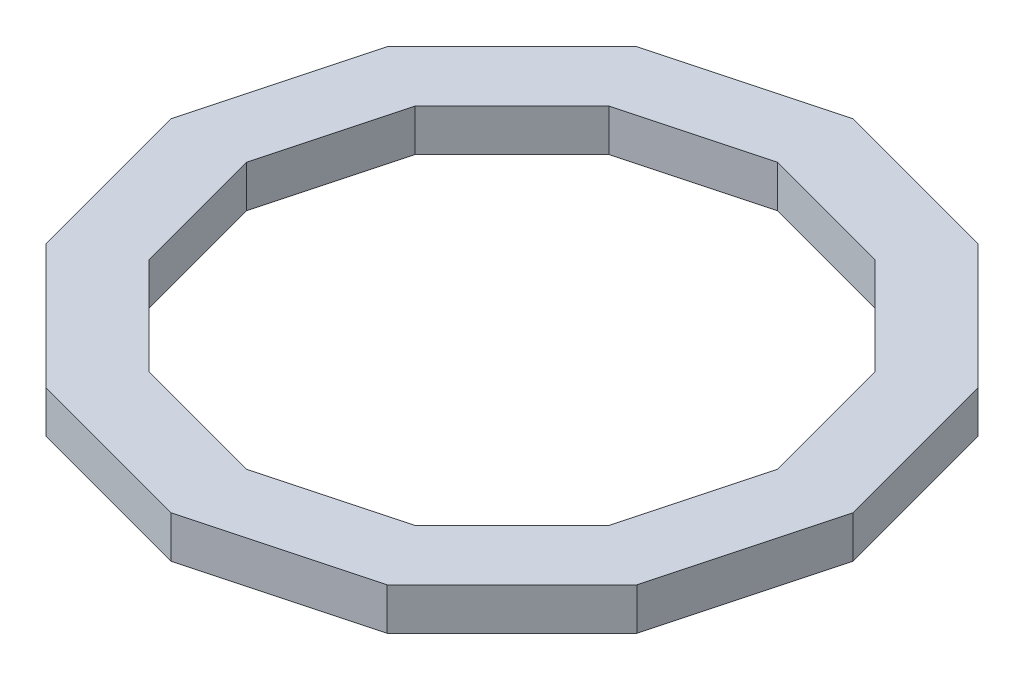
ISO-10303-21;
HEADER;
FILE_DESCRIPTION(('STEP AP214'),'2;1');
FILE_NAME('part.step','',(''),(''),'','','');
FILE_SCHEMA(('AUTOMOTIVE_DESIGN { 1 0 10303 214 1 1 1 1 }'));
ENDSEC;
DATA;
#1=APPLICATION_CONTEXT('core data for automotive mechanical design processes');
#2=APPLICATION_PROTOCOL_DEFINITION('international standard','automotive_design',2000,#1);
#3=PRODUCT_CONTEXT('',#1,'mechanical');
#4=PRODUCT('Part','Part','',(#3));
#5=PRODUCT_RELATED_PRODUCT_CATEGORY('part','',(#4));
#6=PRODUCT_DEFINITION_FORMATION('','',#4);
#7=PRODUCT_DEFINITION_CONTEXT('part definition',#1,'design');
#8=PRODUCT_DEFINITION('design','',#6,#7);
#9=PRODUCT_DEFINITION_SHAPE('','',#8);
#10=(LENGTH_UNIT() NAMED_UNIT(*) SI_UNIT(.MILLI.,.METRE.));
#11=(NAMED_UNIT(*) PLANE_ANGLE_UNIT() SI_UNIT($,.RADIAN.));
#12=(NAMED_UNIT(*) SI_UNIT($,.STERADIAN.) SOLID_ANGLE_UNIT());
#13=UNCERTAINTY_MEASURE_WITH_UNIT(LENGTH_MEASURE(1.E-05),#10,'distance_accuracy_value','');
#14=(GEOMETRIC_REPRESENTATION_CONTEXT(3) GLOBAL_UNCERTAINTY_ASSIGNED_CONTEXT((#13)) GLOBAL_UNIT_ASSIGNED_CONTEXT((#10,
#11,#12)) REPRESENTATION_CONTEXT('',''));
#15=CARTESIAN_POINT('',(0.,0.,0.));
#16=DIRECTION('',(0.,0.,1.));
#17=DIRECTION('',(1.,0.,0.));
#18=AXIS2_PLACEMENT_3D('',#15,#16,#17);
#19=CARTESIAN_POINT('',(0.,19.05,0.));
#20=DIRECTION('',(0.,1.,0.));
#21=DIRECTION('',(0.,0.,1.));
#22=AXIS2_PLACEMENT_3D('',#19,#20,#21);
#23=PLANE('',#22);
#24=DIRECTION('',(-0.258819045102521,0.,0.965925826289069));
#25=VECTOR('',#24,1.);
#26=CARTESIAN_POINT('',(-133.859338924124,19.05,-77.2837253613884));
#27=LINE('',#26,#25);
#28=CARTESIAN_POINT('',(-133.859338924124,19.05,-77.2837253613884));
#29=VERTEX_POINT('',#28);
#30=CARTESIAN_POINT('',(-154.567450722777,19.05,0.));
#31=VERTEX_POINT('',#30);
#32=EDGE_CURVE('E287',#29,#31,#27,.T.);
#33=ORIENTED_EDGE('',*,*,#32,.T.);
#34=DIRECTION('',(0.258819045102521,0.,0.965925826289068));
#35=VECTOR('',#34,1.);
#36=CARTESIAN_POINT('',(-154.567450722777,19.05,0.));
#37=LINE('',#36,#35);
#38=CARTESIAN_POINT('',(-133.859338924124,19.05,77.2837253613883));
#39=VERTEX_POINT('',#38);
#40=EDGE_CURVE('E290',#31,#39,#37,.T.);
#41=ORIENTED_EDGE('',*,*,#40,.T.);
#42=DIRECTION('',(0.707106781186548,0.,0.707106781186547));
#43=VECTOR('',#42,1.);
#44=CARTESIAN_POINT('',(-133.859338924124,19.05,77.2837253613883));
#45=LINE('',#44,#43);
#46=CARTESIAN_POINT('',(-77.2837253613883,19.05,133.859338924124));
#47=VERTEX_POINT('',#46);
#48=EDGE_CURVE('E293',#39,#47,#45,.T.);
#49=ORIENTED_EDGE('',*,*,#48,.T.);
#50=DIRECTION('',(0.965925826289068,0.,0.25881904510252));
#51=VECTOR('',#50,1.);
#52=CARTESIAN_POINT('',(-77.2837253613883,19.05,133.859338924124));
#53=LINE('',#52,#51);
#54=CARTESIAN_POINT('',(1.37600092565881E-13,19.05,154.567450722777));
#55=VERTEX_POINT('',#54);
#56=EDGE_CURVE('E295',#47,#55,#53,.T.);
#57=ORIENTED_EDGE('',*,*,#56,.T.);
#58=DIRECTION('',(0.965925826289068,0.,-0.258819045102521));
#59=VECTOR('',#58,1.);
#60=CARTESIAN_POINT('',(1.37600092565881E-13,19.05,154.567450722777));
#61=LINE('',#60,#59);
#62=CARTESIAN_POINT('',(77.2837253613884,19.05,133.859338924124));
#63=VERTEX_POINT('',#62);
#64=EDGE_CURVE('E297',#55,#63,#61,.T.);
#65=ORIENTED_EDGE('',*,*,#64,.T.);
#66=DIRECTION('',(0.707106781186547,0.,-0.707106781186548));
#67=VECTOR('',#66,1.);
#68=CARTESIAN_POINT('',(77.2837253613884,19.05,133.859338924124));
#69=LINE('',#68,#67);
#70=CARTESIAN_POINT('',(133.859338924124,19.05,77.2837253613883));
#71=VERTEX_POINT('',#70);
#72=EDGE_CURVE('E299',#63,#71,#69,.T.);
#73=ORIENTED_EDGE('',*,*,#72,.T.);
#74=DIRECTION('',(0.25881904510252,0.,-0.965925826289068));
#75=VECTOR('',#74,1.);
#76=CARTESIAN_POINT('',(133.859338924124,19.05,77.2837253613883));
#77=LINE('',#76,#75);
#78=CARTESIAN_POINT('',(154.567450722777,19.05,0.));
#79=VERTEX_POINT('',#78);
#80=EDGE_CURVE('E301',#71,#79,#77,.T.);
#81=ORIENTED_EDGE('',*,*,#80,.T.);
#82=DIRECTION('',(-0.258819045102521,0.,-0.965925826289068));
#83=VECTOR('',#82,1.);
#84=CARTESIAN_POINT('',(154.567450722777,19.05,0.));
#85=LINE('',#84,#83);
#86=CARTESIAN_POINT('',(133.859338924124,19.05,-77.2837253613884));
#87=VERTEX_POINT('',#86);
#88=EDGE_CURVE('E303',#79,#87,#85,.T.);
#89=ORIENTED_EDGE('',*,*,#88,.T.);
#90=DIRECTION('',(-0.707106781186548,0.,-0.707106781186548));
#91=VECTOR('',#90,1.);
#92=CARTESIAN_POINT('',(133.859338924124,19.05,-77.2837253613884));
#93=LINE('',#92,#91);
#94=CARTESIAN_POINT('',(77.2837253613882,19.05,-133.859338924124));
#95=VERTEX_POINT('',#94);
#96=EDGE_CURVE('E305',#87,#95,#93,.T.);
#97=ORIENTED_EDGE('',*,*,#96,.T.);
#98=DIRECTION('',(-0.965925826289068,0.,-0.25881904510252));
#99=VECTOR('',#98,1.);
#100=CARTESIAN_POINT('',(77.2837253613882,19.05,-133.859338924124));
#101=LINE('',#100,#99);
#102=CARTESIAN_POINT('',(0.,19.05,-154.567450722777));
#103=VERTEX_POINT('',#102);
#104=EDGE_CURVE('E307',#95,#103,#101,.T.);
#105=ORIENTED_EDGE('',*,*,#104,.T.);
#106=DIRECTION('',(-0.965925826289068,0.,0.258819045102521));
#107=VECTOR('',#106,1.);
#108=CARTESIAN_POINT('',(0.,19.05,-154.567450722777));
#109=LINE('',#108,#107);
#110=CARTESIAN_POINT('',(-77.2837253613884,19.05,-133.859338924124));
#111=VERTEX_POINT('',#110);
#112=EDGE_CURVE('E309',#103,#111,#109,.T.);
#113=ORIENTED_EDGE('',*,*,#112,.T.);
#114=DIRECTION('',(-0.707106781186548,0.,0.707106781186548));
#115=VECTOR('',#114,1.);
#116=CARTESIAN_POINT('',(-77.2837253613884,19.05,-133.859338924124));
#117=LINE('',#116,#115);
#118=EDGE_CURVE('E311',#111,#29,#117,.T.);
#119=ORIENTED_EDGE('',*,*,#118,.T.);
#120=EDGE_LOOP('',(#33,#41,#49,#57,#65,#73,#81,#89,#97,#105,#113,#119));
#121=FACE_BOUND('',#120,.T.);
#122=DIRECTION('',(0.258819045102521,0.,0.965925826289068));
#123=VECTOR('',#122,1.);
#124=CARTESIAN_POINT('',(-120.382631245636,19.05,0.));
#125=LINE('',#124,#123);
#126=CARTESIAN_POINT('',(-120.382631245636,19.05,0.));
#127=VERTEX_POINT('',#126);
#128=CARTESIAN_POINT('',(-104.254416833135,19.05,60.1913156228179));
#129=VERTEX_POINT('',#128);
#130=EDGE_CURVE('E202',#127,#129,#125,.T.);
#131=ORIENTED_EDGE('',*,*,#130,.F.);
#132=DIRECTION('',(-0.25881904510252,0.,0.965925826289068));
#133=VECTOR('',#132,1.);
#134=CARTESIAN_POINT('',(-104.254416833135,19.05,-60.1913156228179));
#135=LINE('',#134,#133);
#136=CARTESIAN_POINT('',(-104.254416833135,19.05,-60.1913156228179));
#137=VERTEX_POINT('',#136);
#138=EDGE_CURVE('E194',#137,#127,#135,.T.);
#139=ORIENTED_EDGE('',*,*,#138,.F.);
#140=DIRECTION('',(-0.707106781186547,0.,0.707106781186547));
#141=VECTOR('',#140,1.);
#142=CARTESIAN_POINT('',(-60.1913156228179,19.05,-104.254416833135));
#143=LINE('',#142,#141);
#144=CARTESIAN_POINT('',(-60.1913156228179,19.05,-104.254416833135));
#145=VERTEX_POINT('',#144);
#146=EDGE_CURVE('E235',#145,#137,#143,.T.);
#147=ORIENTED_EDGE('',*,*,#146,.F.);
#148=DIRECTION('',(-0.965925826289068,0.,0.258819045102521));
#149=VECTOR('',#148,1.);
#150=CARTESIAN_POINT('',(0.,19.05,-120.382631245636));
#151=LINE('',#150,#149);
#152=CARTESIAN_POINT('',(0.,19.05,-120.382631245636));
#153=VERTEX_POINT('',#152);
#154=EDGE_CURVE('E233',#153,#145,#151,.T.);
#155=ORIENTED_EDGE('',*,*,#154,.F.);
#156=DIRECTION('',(-0.965925826289068,0.,-0.25881904510252));
#157=VECTOR('',#156,1.);
#158=CARTESIAN_POINT('',(60.1913156228179,19.05,-104.254416833135));
#159=LINE('',#158,#157);
#160=CARTESIAN_POINT('',(60.1913156228179,19.05,-104.254416833135));
#161=VERTEX_POINT('',#160);
#162=EDGE_CURVE('E231',#161,#153,#159,.T.);
#163=ORIENTED_EDGE('',*,*,#162,.F.);
#164=DIRECTION('',(-0.707106781186547,0.,-0.707106781186548));
#165=VECTOR('',#164,1.);
#166=CARTESIAN_POINT('',(104.254416833135,19.05,-60.191315622818));
#167=LINE('',#166,#165);
#168=CARTESIAN_POINT('',(104.254416833135,19.05,-60.191315622818));
#169=VERTEX_POINT('',#168);
#170=EDGE_CURVE('E229',#169,#161,#167,.T.);
#171=ORIENTED_EDGE('',*,*,#170,.F.);
#172=DIRECTION('',(-0.258819045102521,0.,-0.965925826289068));
#173=VECTOR('',#172,1.);
#174=CARTESIAN_POINT('',(120.382631245636,19.05,0.));
#175=LINE('',#174,#173);
#176=CARTESIAN_POINT('',(120.382631245636,19.05,0.));
#177=VERTEX_POINT('',#176);
#178=EDGE_CURVE('E227',#177,#169,#175,.T.);
#179=ORIENTED_EDGE('',*,*,#178,.F.);
#180=DIRECTION('',(0.25881904510252,0.,-0.965925826289068));
#181=VECTOR('',#180,1.);
#182=CARTESIAN_POINT('',(104.254416833135,19.05,60.1913156228179));
#183=LINE('',#182,#181);
#184=CARTESIAN_POINT('',(104.254416833135,19.05,60.1913156228179));
#185=VERTEX_POINT('',#184);
#186=EDGE_CURVE('E225',#185,#177,#183,.T.);
#187=ORIENTED_EDGE('',*,*,#186,.F.);
#188=DIRECTION('',(0.707106781186547,0.,-0.707106781186548));
#189=VECTOR('',#188,1.);
#190=CARTESIAN_POINT('',(60.1913156228179,19.05,104.254416833135));
#191=LINE('',#190,#189);
#192=CARTESIAN_POINT('',(60.1913156228179,19.05,104.254416833135));
#193=VERTEX_POINT('',#192);
#194=EDGE_CURVE('E223',#193,#185,#191,.T.);
#195=ORIENTED_EDGE('',*,*,#194,.F.);
#196=DIRECTION('',(0.965925826289068,0.,-0.258819045102521));
#197=VECTOR('',#196,1.);
#198=CARTESIAN_POINT('',(0.,19.05,120.382631245636));
#199=LINE('',#198,#197);
#200=CARTESIAN_POINT('',(0.,19.05,120.382631245636));
#201=VERTEX_POINT('',#200);
#202=EDGE_CURVE('E221',#201,#193,#199,.T.);
#203=ORIENTED_EDGE('',*,*,#202,.F.);
#204=DIRECTION('',(0.965925826289068,0.,0.25881904510252));
#205=VECTOR('',#204,1.);
#206=CARTESIAN_POINT('',(-60.1913156228178,19.05,104.254416833135));
#207=LINE('',#206,#205);
#208=CARTESIAN_POINT('',(-60.1913156228178,19.05,104.254416833135));
#209=VERTEX_POINT('',#208);
#210=EDGE_CURVE('E217',#209,#201,#207,.T.);
#211=ORIENTED_EDGE('',*,*,#210,.F.);
#212=DIRECTION('',(0.707106781186548,0.,0.707106781186547));
#213=VECTOR('',#212,1.);
#214=CARTESIAN_POINT('',(-104.254416833135,19.05,60.1913156228179));
#215=LINE('',#214,#213);
#216=EDGE_CURVE('E215',#129,#209,#215,.T.);
#217=ORIENTED_EDGE('',*,*,#216,.F.);
#218=EDGE_LOOP('',(#131,#139,#147,#155,#163,#171,#179,#187,#195,#203,#211,#217));
#219=FACE_BOUND('',#218,.T.);
#220=ADVANCED_FACE('F33',(#121,#219),#23,.T.);
#221=CARTESIAN_POINT('',(0.,0.,0.));
#222=DIRECTION('',(0.,1.,0.));
#223=DIRECTION('',(0.,0.,1.));
#224=AXIS2_PLACEMENT_3D('',#221,#222,#223);
#225=PLANE('',#224);
#226=DIRECTION('',(-0.258819045102521,0.,0.965925826289069));
#227=VECTOR('',#226,1.);
#228=CARTESIAN_POINT('',(-133.859338924124,0.,-77.2837253613884));
#229=LINE('',#228,#227);
#230=CARTESIAN_POINT('',(-133.859338924124,0.,-77.2837253613884));
#231=VERTEX_POINT('',#230);
#232=CARTESIAN_POINT('',(-154.567450722777,0.,0.));
#233=VERTEX_POINT('',#232);
#234=EDGE_CURVE('E210',#231,#233,#229,.T.);
#235=ORIENTED_EDGE('',*,*,#234,.F.);
#236=DIRECTION('',(-0.707106781186548,0.,0.707106781186548));
#237=VECTOR('',#236,1.);
#238=CARTESIAN_POINT('',(-77.2837253613884,0.,-133.859338924124));
#239=LINE('',#238,#237);
#240=CARTESIAN_POINT('',(-77.2837253613884,0.,-133.859338924124));
#241=VERTEX_POINT('',#240);
#242=EDGE_CURVE('E291',#241,#231,#239,.T.);
#243=ORIENTED_EDGE('',*,*,#242,.F.);
#244=DIRECTION('',(-0.965925826289068,0.,0.258819045102521));
#245=VECTOR('',#244,1.);
#246=CARTESIAN_POINT('',(0.,0.,-154.567450722777));
#247=LINE('',#246,#245);
#248=CARTESIAN_POINT('',(0.,0.,-154.567450722777));
#249=VERTEX_POINT('',#248);
#250=EDGE_CURVE('E334',#249,#241,#247,.T.);
#251=ORIENTED_EDGE('',*,*,#250,.F.);
#252=DIRECTION('',(-0.965925826289068,0.,-0.25881904510252));
#253=VECTOR('',#252,1.);
#254=CARTESIAN_POINT('',(77.2837253613882,0.,-133.859338924124));
#255=LINE('',#254,#253);
#256=CARTESIAN_POINT('',(77.2837253613882,0.,-133.859338924124));
#257=VERTEX_POINT('',#256);
#258=EDGE_CURVE('E332',#257,#249,#255,.T.);
#259=ORIENTED_EDGE('',*,*,#258,.F.);
#260=DIRECTION('',(-0.707106781186548,0.,-0.707106781186548));
#261=VECTOR('',#260,1.);
#262=CARTESIAN_POINT('',(133.859338924124,0.,-77.2837253613884));
#263=LINE('',#262,#261);
#264=CARTESIAN_POINT('',(133.859338924124,0.,-77.2837253613884));
#265=VERTEX_POINT('',#264);
#266=EDGE_CURVE('E330',#265,#257,#263,.T.);
#267=ORIENTED_EDGE('',*,*,#266,.F.);
#268=DIRECTION('',(-0.258819045102521,0.,-0.965925826289068));
#269=VECTOR('',#268,1.);
#270=CARTESIAN_POINT('',(154.567450722777,0.,0.));
#271=LINE('',#270,#269);
#272=CARTESIAN_POINT('',(154.567450722777,0.,0.));
#273=VERTEX_POINT('',#272);
#274=EDGE_CURVE('E328',#273,#265,#271,.T.);
#275=ORIENTED_EDGE('',*,*,#274,.F.);
#276=DIRECTION('',(0.25881904510252,0.,-0.965925826289068));
#277=VECTOR('',#276,1.);
#278=CARTESIAN_POINT('',(133.859338924124,0.,77.2837253613883));
#279=LINE('',#278,#277);
#280=CARTESIAN_POINT('',(133.859338924124,0.,77.2837253613883));
#281=VERTEX_POINT('',#280);
#282=EDGE_CURVE('E326',#281,#273,#279,.T.);
#283=ORIENTED_EDGE('',*,*,#282,.F.);
#284=DIRECTION('',(0.707106781186547,0.,-0.707106781186548));
#285=VECTOR('',#284,1.);
#286=CARTESIAN_POINT('',(77.2837253613884,0.,133.859338924124));
#287=LINE('',#286,#285);
#288=CARTESIAN_POINT('',(77.2837253613884,0.,133.859338924124));
#289=VERTEX_POINT('',#288);
#290=EDGE_CURVE('E324',#289,#281,#287,.T.);
#291=ORIENTED_EDGE('',*,*,#290,.F.);
#292=DIRECTION('',(0.965925826289068,0.,-0.258819045102521));
#293=VECTOR('',#292,1.);
#294=CARTESIAN_POINT('',(1.37600092565881E-13,0.,154.567450722777));
#295=LINE('',#294,#293);
#296=CARTESIAN_POINT('',(1.37600092565881E-13,0.,154.567450722777));
#297=VERTEX_POINT('',#296);
#298=EDGE_CURVE('E322',#297,#289,#295,.T.);
#299=ORIENTED_EDGE('',*,*,#298,.F.);
#300=DIRECTION('',(0.965925826289068,0.,0.25881904510252));
#301=VECTOR('',#300,1.);
#302=CARTESIAN_POINT('',(-77.2837253613883,0.,133.859338924124));
#303=LINE('',#302,#301);
#304=CARTESIAN_POINT('',(-77.2837253613883,0.,133.859338924124));
#305=VERTEX_POINT('',#304);
#306=EDGE_CURVE('E320',#305,#297,#303,.T.);
#307=ORIENTED_EDGE('',*,*,#306,.F.);
#308=DIRECTION('',(0.707106781186548,0.,0.707106781186547));
#309=VECTOR('',#308,1.);
#310=CARTESIAN_POINT('',(-133.859338924124,0.,77.2837253613883));
#311=LINE('',#310,#309);
#312=CARTESIAN_POINT('',(-133.859338924124,0.,77.2837253613883));
#313=VERTEX_POINT('',#312);
#314=EDGE_CURVE('E318',#313,#305,#311,.T.);
#315=ORIENTED_EDGE('',*,*,#314,.F.);
#316=DIRECTION('',(0.258819045102521,0.,0.965925826289068));
#317=VECTOR('',#316,1.);
#318=CARTESIAN_POINT('',(-154.567450722777,0.,0.));
#319=LINE('',#318,#317);
#320=EDGE_CURVE('E316',#233,#313,#319,.T.);
#321=ORIENTED_EDGE('',*,*,#320,.F.);
#322=EDGE_LOOP('',(#235,#243,#251,#259,#267,#275,#283,#291,#299,#307,#315,#321));
#323=FACE_BOUND('',#322,.T.);
#324=DIRECTION('',(-0.25881904510252,0.,0.965925826289068));
#325=VECTOR('',#324,1.);
#326=CARTESIAN_POINT('',(-104.254416833135,0.,-60.1913156228179));
#327=LINE('',#326,#325);
#328=CARTESIAN_POINT('',(-104.254416833135,0.,-60.191315622818));
#329=VERTEX_POINT('',#328);
#330=CARTESIAN_POINT('',(-120.382631245636,0.,0.));
#331=VERTEX_POINT('',#330);
#332=EDGE_CURVE('E56',#329,#331,#327,.T.);
#333=ORIENTED_EDGE('',*,*,#332,.T.);
#334=DIRECTION('',(0.258819045102521,0.,0.965925826289068));
#335=VECTOR('',#334,1.);
#336=CARTESIAN_POINT('',(-120.382631245636,0.,0.));
#337=LINE('',#336,#335);
#338=CARTESIAN_POINT('',(-104.254416833135,0.,60.1913156228179));
#339=VERTEX_POINT('',#338);
#340=EDGE_CURVE('E209',#331,#339,#337,.T.);
#341=ORIENTED_EDGE('',*,*,#340,.T.);
#342=DIRECTION('',(0.707106781186548,0.,0.707106781186547));
#343=VECTOR('',#342,1.);
#344=CARTESIAN_POINT('',(-104.254416833135,0.,60.1913156228179));
#345=LINE('',#344,#343);
#346=CARTESIAN_POINT('',(-60.1913156228178,0.,104.254416833135));
#347=VERTEX_POINT('',#346);
#348=EDGE_CURVE('E239',#339,#347,#345,.T.);
#349=ORIENTED_EDGE('',*,*,#348,.T.);
#350=DIRECTION('',(0.965925826289068,0.,0.25881904510252));
#351=VECTOR('',#350,1.);
#352=CARTESIAN_POINT('',(-60.1913156228178,0.,104.254416833135));
#353=LINE('',#352,#351);
#354=CARTESIAN_POINT('',(0.,0.,120.382631245636));
#355=VERTEX_POINT('',#354);
#356=EDGE_CURVE('E242',#347,#355,#353,.T.);
#357=ORIENTED_EDGE('',*,*,#356,.T.);
#358=DIRECTION('',(0.965925826289068,0.,-0.258819045102521));
#359=VECTOR('',#358,1.);
#360=CARTESIAN_POINT('',(0.,0.,120.382631245636));
#361=LINE('',#360,#359);
#362=CARTESIAN_POINT('',(60.1913156228179,0.,104.254416833135));
#363=VERTEX_POINT('',#362);
#364=EDGE_CURVE('E245',#355,#363,#361,.T.);
#365=ORIENTED_EDGE('',*,*,#364,.T.);
#366=DIRECTION('',(0.707106781186547,0.,-0.707106781186548));
#367=VECTOR('',#366,1.);
#368=CARTESIAN_POINT('',(60.1913156228179,0.,104.254416833135));
#369=LINE('',#368,#367);
#370=CARTESIAN_POINT('',(104.254416833135,0.,60.1913156228179));
#371=VERTEX_POINT('',#370);
#372=EDGE_CURVE('E248',#363,#371,#369,.T.);
#373=ORIENTED_EDGE('',*,*,#372,.T.);
#374=DIRECTION('',(0.25881904510252,0.,-0.965925826289068));
#375=VECTOR('',#374,1.);
#376=CARTESIAN_POINT('',(104.254416833135,0.,60.1913156228179));
#377=LINE('',#376,#375);
#378=CARTESIAN_POINT('',(120.382631245636,0.,0.));
#379=VERTEX_POINT('',#378);
#380=EDGE_CURVE('E251',#371,#379,#377,.T.);
#381=ORIENTED_EDGE('',*,*,#380,.T.);
#382=DIRECTION('',(-0.258819045102521,0.,-0.965925826289068));
#383=VECTOR('',#382,1.);
#384=CARTESIAN_POINT('',(120.382631245636,0.,0.));
#385=LINE('',#384,#383);
#386=CARTESIAN_POINT('',(104.254416833135,0.,-60.191315622818));
#387=VERTEX_POINT('',#386);
#388=EDGE_CURVE('E254',#379,#387,#385,.T.);
#389=ORIENTED_EDGE('',*,*,#388,.T.);
#390=DIRECTION('',(-0.707106781186547,0.,-0.707106781186548));
#391=VECTOR('',#390,1.);
#392=CARTESIAN_POINT('',(104.254416833135,0.,-60.191315622818));
#393=LINE('',#392,#391);
#394=CARTESIAN_POINT('',(60.1913156228179,0.,-104.254416833135));
#395=VERTEX_POINT('',#394);
#396=EDGE_CURVE('E257',#387,#395,#393,.T.);
#397=ORIENTED_EDGE('',*,*,#396,.T.);
#398=DIRECTION('',(-0.965925826289068,0.,-0.25881904510252));
#399=VECTOR('',#398,1.);
#400=CARTESIAN_POINT('',(60.1913156228179,0.,-104.254416833135));
#401=LINE('',#400,#399);
#402=CARTESIAN_POINT('',(0.,0.,-120.382631245636));
#403=VERTEX_POINT('',#402);
#404=EDGE_CURVE('E260',#395,#403,#401,.T.);
#405=ORIENTED_EDGE('',*,*,#404,.T.);
#406=DIRECTION('',(-0.965925826289068,0.,0.258819045102521));
#407=VECTOR('',#406,1.);
#408=CARTESIAN_POINT('',(0.,0.,-120.382631245636));
#409=LINE('',#408,#407);
#410=CARTESIAN_POINT('',(-60.1913156228179,0.,-104.254416833135));
#411=VERTEX_POINT('',#410);
#412=EDGE_CURVE('E263',#403,#411,#409,.T.);
#413=ORIENTED_EDGE('',*,*,#412,.T.);
#414=DIRECTION('',(-0.707106781186547,0.,0.707106781186547));
#415=VECTOR('',#414,1.);
#416=CARTESIAN_POINT('',(-60.1913156228179,0.,-104.254416833135));
#417=LINE('',#416,#415);
#418=EDGE_CURVE('E203',#411,#329,#417,.T.);
#419=ORIENTED_EDGE('',*,*,#418,.T.);
#420=EDGE_LOOP('',(#333,#341,#349,#357,#365,#373,#381,#389,#397,#405,#413,#419));
#421=FACE_BOUND('',#420,.T.);
#422=ADVANCED_FACE('F376',(#323,#421),#225,.F.);
#423=CARTESIAN_POINT('',(-133.859338924124,19.05,-77.2837253613884));
#424=DIRECTION('',(0.965925826289068,0.,0.25881904510252));
#425=DIRECTION('',(0.25881904510252,0.,-0.965925826289069));
#426=AXIS2_PLACEMENT_3D('',#423,#424,#425);
#427=PLANE('',#426);
#428=ORIENTED_EDGE('',*,*,#234,.T.);
#429=DIRECTION('',(0.,-1.,0.));
#430=VECTOR('',#429,1.);
#431=CARTESIAN_POINT('',(-154.567450722777,19.05,0.));
#432=LINE('',#431,#430);
#433=EDGE_CURVE('E11',#31,#233,#432,.T.);
#434=ORIENTED_EDGE('',*,*,#433,.F.);
#435=ORIENTED_EDGE('',*,*,#32,.F.);
#436=DIRECTION('',(0.,-1.,0.));
#437=VECTOR('',#436,1.);
#438=CARTESIAN_POINT('',(-133.859338924124,19.05,-77.2837253613884));
#439=LINE('',#438,#437);
#440=EDGE_CURVE('E313',#29,#231,#439,.T.);
#441=ORIENTED_EDGE('',*,*,#440,.T.);
#442=EDGE_LOOP('',(#428,#434,#435,#441));
#443=FACE_BOUND('',#442,.T.);
#444=ADVANCED_FACE('F35',(#443),#427,.F.);
#445=CARTESIAN_POINT('',(-154.567450722777,19.05,0.));
#446=DIRECTION('',(0.965925826289068,0.,-0.258819045102521));
#447=DIRECTION('',(-0.258819045102521,0.,-0.965925826289068));
#448=AXIS2_PLACEMENT_3D('',#445,#446,#447);
#449=PLANE('',#448);
#450=ORIENTED_EDGE('',*,*,#320,.T.);
#451=DIRECTION('',(0.,-1.,0.));
#452=VECTOR('',#451,1.);
#453=CARTESIAN_POINT('',(-133.859338924124,19.05,77.2837253613883));
#454=LINE('',#453,#452);
#455=EDGE_CURVE('E41',#39,#313,#454,.T.);
#456=ORIENTED_EDGE('',*,*,#455,.F.);
#457=ORIENTED_EDGE('',*,*,#40,.F.);
#458=ORIENTED_EDGE('',*,*,#433,.T.);
#459=EDGE_LOOP('',(#450,#456,#457,#458));
#460=FACE_BOUND('',#459,.T.);
#461=ADVANCED_FACE('F393',(#460),#449,.F.);
#462=CARTESIAN_POINT('',(-133.859338924124,19.05,77.2837253613883));
#463=DIRECTION('',(0.707106781186547,0.,-0.707106781186548));
#464=DIRECTION('',(-0.707106781186548,0.,-0.707106781186547));
#465=AXIS2_PLACEMENT_3D('',#462,#463,#464);
#466=PLANE('',#465);
#467=ORIENTED_EDGE('',*,*,#314,.T.);
#468=DIRECTION('',(0.,-1.,0.));
#469=VECTOR('',#468,1.);
#470=CARTESIAN_POINT('',(-77.2837253613883,19.05,133.859338924124));
#471=LINE('',#470,#469);
#472=EDGE_CURVE('E363',#47,#305,#471,.T.);
#473=ORIENTED_EDGE('',*,*,#472,.F.);
#474=ORIENTED_EDGE('',*,*,#48,.F.);
#475=ORIENTED_EDGE('',*,*,#455,.T.);
#476=EDGE_LOOP('',(#467,#473,#474,#475));
#477=FACE_BOUND('',#476,.T.);
#478=ADVANCED_FACE('F370',(#477),#466,.F.);
#479=CARTESIAN_POINT('',(-77.2837253613883,19.05,133.859338924124));
#480=DIRECTION('',(0.25881904510252,0.,-0.965925826289068));
#481=DIRECTION('',(-0.965925826289069,0.,-0.25881904510252));
#482=AXIS2_PLACEMENT_3D('',#479,#480,#481);
#483=PLANE('',#482);
#484=ORIENTED_EDGE('',*,*,#306,.T.);
#485=DIRECTION('',(0.,-1.,0.));
#486=VECTOR('',#485,1.);
#487=CARTESIAN_POINT('',(1.37600092565881E-13,19.05,154.567450722777));
#488=LINE('',#487,#486);
#489=EDGE_CURVE('E360',#55,#297,#488,.T.);
#490=ORIENTED_EDGE('',*,*,#489,.F.);
#491=ORIENTED_EDGE('',*,*,#56,.F.);
#492=ORIENTED_EDGE('',*,*,#472,.T.);
#493=EDGE_LOOP('',(#484,#490,#491,#492));
#494=FACE_BOUND('',#493,.T.);
#495=ADVANCED_FACE('F382',(#494),#483,.F.);
#496=CARTESIAN_POINT('',(1.37600092565881E-13,19.05,154.567450722777));
#497=DIRECTION('',(-0.258819045102521,0.,-0.965925826289068));
#498=DIRECTION('',(-0.965925826289068,0.,0.258819045102521));
#499=AXIS2_PLACEMENT_3D('',#496,#497,#498);
#500=PLANE('',#499);
#501=ORIENTED_EDGE('',*,*,#298,.T.);
#502=DIRECTION('',(0.,-1.,0.));
#503=VECTOR('',#502,1.);
#504=CARTESIAN_POINT('',(77.2837253613884,19.05,133.859338924124));
#505=LINE('',#504,#503);
#506=EDGE_CURVE('E357',#63,#289,#505,.T.);
#507=ORIENTED_EDGE('',*,*,#506,.F.);
#508=ORIENTED_EDGE('',*,*,#64,.F.);
#509=ORIENTED_EDGE('',*,*,#489,.T.);
#510=EDGE_LOOP('',(#501,#507,#508,#509));
#511=FACE_BOUND('',#510,.T.);
#512=ADVANCED_FACE('F386',(#511),#500,.F.);
#513=CARTESIAN_POINT('',(77.2837253613884,19.05,133.859338924124));
#514=DIRECTION('',(-0.707106781186548,0.,-0.707106781186547));
#515=DIRECTION('',(-0.707106781186547,0.,0.707106781186548));
#516=AXIS2_PLACEMENT_3D('',#513,#514,#515);
#517=PLANE('',#516);
#518=ORIENTED_EDGE('',*,*,#290,.T.);
#519=DIRECTION('',(0.,-1.,0.));
#520=VECTOR('',#519,1.);
#521=CARTESIAN_POINT('',(133.859338924124,19.05,77.2837253613883));
#522=LINE('',#521,#520);
#523=EDGE_CURVE('E354',#71,#281,#522,.T.);
#524=ORIENTED_EDGE('',*,*,#523,.F.);
#525=ORIENTED_EDGE('',*,*,#72,.F.);
#526=ORIENTED_EDGE('',*,*,#506,.T.);
#527=EDGE_LOOP('',(#518,#524,#525,#526));
#528=FACE_BOUND('',#527,.T.);
#529=ADVANCED_FACE('F426',(#528),#517,.F.);
#530=CARTESIAN_POINT('',(133.859338924124,19.05,77.2837253613883));
#531=DIRECTION('',(-0.965925826289068,0.,-0.258819045102521));
#532=DIRECTION('',(-0.258819045102521,0.,0.965925826289068));
#533=AXIS2_PLACEMENT_3D('',#530,#531,#532);
#534=PLANE('',#533);
#535=ORIENTED_EDGE('',*,*,#282,.T.);
#536=DIRECTION('',(0.,-1.,0.));
#537=VECTOR('',#536,1.);
#538=CARTESIAN_POINT('',(154.567450722777,19.05,0.));
#539=LINE('',#538,#537);
#540=EDGE_CURVE('E351',#79,#273,#539,.T.);
#541=ORIENTED_EDGE('',*,*,#540,.F.);
#542=ORIENTED_EDGE('',*,*,#80,.F.);
#543=ORIENTED_EDGE('',*,*,#523,.T.);
#544=EDGE_LOOP('',(#535,#541,#542,#543));
#545=FACE_BOUND('',#544,.T.);
#546=ADVANCED_FACE('F424',(#545),#534,.F.);
#547=CARTESIAN_POINT('',(154.567450722777,19.05,0.));
#548=DIRECTION('',(-0.965925826289068,0.,0.258819045102521));
#549=DIRECTION('',(0.258819045102521,0.,0.965925826289068));
#550=AXIS2_PLACEMENT_3D('',#547,#548,#549);
#551=PLANE('',#550);
#552=ORIENTED_EDGE('',*,*,#274,.T.);
#553=DIRECTION('',(0.,-1.,0.));
#554=VECTOR('',#553,1.);
#555=CARTESIAN_POINT('',(133.859338924124,19.05,-77.2837253613884));
#556=LINE('',#555,#554);
#557=EDGE_CURVE('E348',#87,#265,#556,.T.);
#558=ORIENTED_EDGE('',*,*,#557,.F.);
#559=ORIENTED_EDGE('',*,*,#88,.F.);
#560=ORIENTED_EDGE('',*,*,#540,.T.);
#561=EDGE_LOOP('',(#552,#558,#559,#560));
#562=FACE_BOUND('',#561,.T.);
#563=ADVANCED_FACE('F420',(#562),#551,.F.);
#564=CARTESIAN_POINT('',(133.859338924124,19.05,-77.2837253613884));
#565=DIRECTION('',(-0.707106781186548,0.,0.707106781186548));
#566=DIRECTION('',(0.707106781186548,0.,0.707106781186548));
#567=AXIS2_PLACEMENT_3D('',#564,#565,#566);
#568=PLANE('',#567);
#569=ORIENTED_EDGE('',*,*,#266,.T.);
#570=DIRECTION('',(0.,-1.,0.));
#571=VECTOR('',#570,1.);
#572=CARTESIAN_POINT('',(77.2837253613882,19.05,-133.859338924124));
#573=LINE('',#572,#571);
#574=EDGE_CURVE('E345',#95,#257,#573,.T.);
#575=ORIENTED_EDGE('',*,*,#574,.F.);
#576=ORIENTED_EDGE('',*,*,#96,.F.);
#577=ORIENTED_EDGE('',*,*,#557,.T.);
#578=EDGE_LOOP('',(#569,#575,#576,#577));
#579=FACE_BOUND('',#578,.T.);
#580=ADVANCED_FACE('F415',(#579),#568,.F.);
#581=CARTESIAN_POINT('',(77.2837253613882,19.05,-133.859338924124));
#582=DIRECTION('',(-0.25881904510252,0.,0.965925826289068));
#583=DIRECTION('',(0.965925826289069,0.,0.25881904510252));
#584=AXIS2_PLACEMENT_3D('',#581,#582,#583);
#585=PLANE('',#584);
#586=ORIENTED_EDGE('',*,*,#258,.T.);
#587=DIRECTION('',(0.,-1.,0.));
#588=VECTOR('',#587,1.);
#589=CARTESIAN_POINT('',(0.,19.05,-154.567450722777));
#590=LINE('',#589,#588);
#591=EDGE_CURVE('E342',#103,#249,#590,.T.);
#592=ORIENTED_EDGE('',*,*,#591,.F.);
#593=ORIENTED_EDGE('',*,*,#104,.F.);
#594=ORIENTED_EDGE('',*,*,#574,.T.);
#595=EDGE_LOOP('',(#586,#592,#593,#594));
#596=FACE_BOUND('',#595,.T.);
#597=ADVANCED_FACE('F409',(#596),#585,.F.);
#598=CARTESIAN_POINT('',(0.,19.05,-154.567450722777));
#599=DIRECTION('',(0.258819045102521,0.,0.965925826289068));
#600=DIRECTION('',(0.965925826289068,0.,-0.258819045102521));
#601=AXIS2_PLACEMENT_3D('',#598,#599,#600);
#602=PLANE('',#601);
#603=ORIENTED_EDGE('',*,*,#250,.T.);
#604=DIRECTION('',(0.,-1.,0.));
#605=VECTOR('',#604,1.);
#606=CARTESIAN_POINT('',(-77.2837253613884,19.05,-133.859338924124));
#607=LINE('',#606,#605);
#608=EDGE_CURVE('E339',#111,#241,#607,.T.);
#609=ORIENTED_EDGE('',*,*,#608,.F.);
#610=ORIENTED_EDGE('',*,*,#112,.F.);
#611=ORIENTED_EDGE('',*,*,#591,.T.);
#612=EDGE_LOOP('',(#603,#609,#610,#611));
#613=FACE_BOUND('',#612,.T.);
#614=ADVANCED_FACE('F405',(#613),#602,.F.);
#615=CARTESIAN_POINT('',(-77.2837253613884,19.05,-133.859338924124));
#616=DIRECTION('',(0.707106781186548,0.,0.707106781186548));
#617=DIRECTION('',(0.707106781186548,0.,-0.707106781186548));
#618=AXIS2_PLACEMENT_3D('',#615,#616,#617);
#619=PLANE('',#618);
#620=ORIENTED_EDGE('',*,*,#242,.T.);
#621=ORIENTED_EDGE('',*,*,#440,.F.);
#622=ORIENTED_EDGE('',*,*,#118,.F.);
#623=ORIENTED_EDGE('',*,*,#608,.T.);
#624=EDGE_LOOP('',(#620,#621,#622,#623));
#625=FACE_BOUND('',#624,.T.);
#626=ADVANCED_FACE('F400',(#625),#619,.F.);
#627=CARTESIAN_POINT('',(-104.254416833135,19.05,-60.1913156228179));
#628=DIRECTION('',(0.965925826289068,0.,0.25881904510252));
#629=DIRECTION('',(0.25881904510252,0.,-0.965925826289068));
#630=AXIS2_PLACEMENT_3D('',#627,#628,#629);
#631=PLANE('',#630);
#632=ORIENTED_EDGE('',*,*,#332,.F.);
#633=DIRECTION('',(0.,-1.,0.));
#634=VECTOR('',#633,1.);
#635=CARTESIAN_POINT('',(-104.254416833135,19.05,-60.1913156228179));
#636=LINE('',#635,#634);
#637=EDGE_CURVE('E198',#137,#329,#636,.T.);
#638=ORIENTED_EDGE('',*,*,#637,.F.);
#639=ORIENTED_EDGE('',*,*,#138,.T.);
#640=DIRECTION('',(0.,-1.,0.));
#641=VECTOR('',#640,1.);
#642=CARTESIAN_POINT('',(-120.382631245636,19.05,0.));
#643=LINE('',#642,#641);
#644=EDGE_CURVE('E197',#127,#331,#643,.T.);
#645=ORIENTED_EDGE('',*,*,#644,.T.);
#646=EDGE_LOOP('',(#632,#638,#639,#645));
#647=FACE_BOUND('',#646,.T.);
#648=ADVANCED_FACE('F196',(#647),#631,.T.);
#649=CARTESIAN_POINT('',(-120.382631245636,19.05,0.));
#650=DIRECTION('',(0.965925826289068,0.,-0.258819045102521));
#651=DIRECTION('',(-0.258819045102521,0.,-0.965925826289068));
#652=AXIS2_PLACEMENT_3D('',#649,#650,#651);
#653=PLANE('',#652);
#654=ORIENTED_EDGE('',*,*,#340,.F.);
#655=ORIENTED_EDGE('',*,*,#644,.F.);
#656=ORIENTED_EDGE('',*,*,#130,.T.);
#657=DIRECTION('',(0.,-1.,0.));
#658=VECTOR('',#657,1.);
#659=CARTESIAN_POINT('',(-104.254416833135,19.05,60.1913156228179));
#660=LINE('',#659,#658);
#661=EDGE_CURVE('E211',#129,#339,#660,.T.);
#662=ORIENTED_EDGE('',*,*,#661,.T.);
#663=EDGE_LOOP('',(#654,#655,#656,#662));
#664=FACE_BOUND('',#663,.T.);
#665=ADVANCED_FACE('F206',(#664),#653,.T.);
#666=CARTESIAN_POINT('',(-104.254416833135,19.05,60.1913156228179));
#667=DIRECTION('',(0.707106781186547,0.,-0.707106781186548));
#668=DIRECTION('',(-0.707106781186548,0.,-0.707106781186547));
#669=AXIS2_PLACEMENT_3D('',#666,#667,#668);
#670=PLANE('',#669);
#671=ORIENTED_EDGE('',*,*,#348,.F.);
#672=ORIENTED_EDGE('',*,*,#661,.F.);
#673=ORIENTED_EDGE('',*,*,#216,.T.);
#674=DIRECTION('',(0.,-1.,0.));
#675=VECTOR('',#674,1.);
#676=CARTESIAN_POINT('',(-60.1913156228178,19.05,104.254416833135));
#677=LINE('',#676,#675);
#678=EDGE_CURVE('E284',#209,#347,#677,.T.);
#679=ORIENTED_EDGE('',*,*,#678,.T.);
#680=EDGE_LOOP('',(#671,#672,#673,#679));
#681=FACE_BOUND('',#680,.T.);
#682=ADVANCED_FACE('F484',(#681),#670,.T.);
#683=CARTESIAN_POINT('',(-60.1913156228178,19.05,104.254416833135));
#684=DIRECTION('',(0.25881904510252,0.,-0.965925826289068));
#685=DIRECTION('',(-0.965925826289069,0.,-0.25881904510252));
#686=AXIS2_PLACEMENT_3D('',#683,#684,#685);
#687=PLANE('',#686);
#688=ORIENTED_EDGE('',*,*,#356,.F.);
#689=ORIENTED_EDGE('',*,*,#678,.F.);
#690=ORIENTED_EDGE('',*,*,#210,.T.);
#691=DIRECTION('',(0.,-1.,0.));
#692=VECTOR('',#691,1.);
#693=CARTESIAN_POINT('',(0.,19.05,120.382631245636));
#694=LINE('',#693,#692);
#695=EDGE_CURVE('E282',#201,#355,#694,.T.);
#696=ORIENTED_EDGE('',*,*,#695,.T.);
#697=EDGE_LOOP('',(#688,#689,#690,#696));
#698=FACE_BOUND('',#697,.T.);
#699=ADVANCED_FACE('F490',(#698),#687,.T.);
#700=CARTESIAN_POINT('',(0.,19.05,120.382631245636));
#701=DIRECTION('',(-0.258819045102521,0.,-0.965925826289068));
#702=DIRECTION('',(-0.965925826289068,0.,0.258819045102521));
#703=AXIS2_PLACEMENT_3D('',#700,#701,#702);
#704=PLANE('',#703);
#705=ORIENTED_EDGE('',*,*,#364,.F.);
#706=ORIENTED_EDGE('',*,*,#695,.F.);
#707=ORIENTED_EDGE('',*,*,#202,.T.);
#708=DIRECTION('',(0.,-1.,0.));
#709=VECTOR('',#708,1.);
#710=CARTESIAN_POINT('',(60.1913156228179,19.05,104.254416833135));
#711=LINE('',#710,#709);
#712=EDGE_CURVE('E280',#193,#363,#711,.T.);
#713=ORIENTED_EDGE('',*,*,#712,.T.);
#714=EDGE_LOOP('',(#705,#706,#707,#713));
#715=FACE_BOUND('',#714,.T.);
#716=ADVANCED_FACE('F498',(#715),#704,.T.);
#717=CARTESIAN_POINT('',(60.1913156228179,19.05,104.254416833135));
#718=DIRECTION('',(-0.707106781186548,0.,-0.707106781186547));
#719=DIRECTION('',(-0.707106781186547,0.,0.707106781186548));
#720=AXIS2_PLACEMENT_3D('',#717,#718,#719);
#721=PLANE('',#720);
#722=ORIENTED_EDGE('',*,*,#372,.F.);
#723=ORIENTED_EDGE('',*,*,#712,.F.);
#724=ORIENTED_EDGE('',*,*,#194,.T.);
#725=DIRECTION('',(0.,-1.,0.));
#726=VECTOR('',#725,1.);
#727=CARTESIAN_POINT('',(104.254416833135,19.05,60.1913156228179));
#728=LINE('',#727,#726);
#729=EDGE_CURVE('E278',#185,#371,#728,.T.);
#730=ORIENTED_EDGE('',*,*,#729,.T.);
#731=EDGE_LOOP('',(#722,#723,#724,#730));
#732=FACE_BOUND('',#731,.T.);
#733=ADVANCED_FACE('F506',(#732),#721,.T.);
#734=CARTESIAN_POINT('',(104.254416833135,19.05,60.1913156228179));
#735=DIRECTION('',(-0.965925826289068,0.,-0.25881904510252));
#736=DIRECTION('',(-0.25881904510252,0.,0.965925826289069));
#737=AXIS2_PLACEMENT_3D('',#734,#735,#736);
#738=PLANE('',#737);
#739=ORIENTED_EDGE('',*,*,#380,.F.);
#740=ORIENTED_EDGE('',*,*,#729,.F.);
#741=ORIENTED_EDGE('',*,*,#186,.T.);
#742=DIRECTION('',(0.,-1.,0.));
#743=VECTOR('',#742,1.);
#744=CARTESIAN_POINT('',(120.382631245636,19.05,0.));
#745=LINE('',#744,#743);
#746=EDGE_CURVE('E276',#177,#379,#745,.T.);
#747=ORIENTED_EDGE('',*,*,#746,.T.);
#748=EDGE_LOOP('',(#739,#740,#741,#747));
#749=FACE_BOUND('',#748,.T.);
#750=ADVANCED_FACE('F514',(#749),#738,.T.);
#751=CARTESIAN_POINT('',(120.382631245636,19.05,0.));
#752=DIRECTION('',(-0.965925826289068,0.,0.258819045102521));
#753=DIRECTION('',(0.258819045102521,0.,0.965925826289068));
#754=AXIS2_PLACEMENT_3D('',#751,#752,#753);
#755=PLANE('',#754);
#756=ORIENTED_EDGE('',*,*,#388,.F.);
#757=ORIENTED_EDGE('',*,*,#746,.F.);
#758=ORIENTED_EDGE('',*,*,#178,.T.);
#759=DIRECTION('',(0.,-1.,0.));
#760=VECTOR('',#759,1.);
#761=CARTESIAN_POINT('',(104.254416833135,19.05,-60.191315622818));
#762=LINE('',#761,#760);
#763=EDGE_CURVE('E274',#169,#387,#762,.T.);
#764=ORIENTED_EDGE('',*,*,#763,.T.);
#765=EDGE_LOOP('',(#756,#757,#758,#764));
#766=FACE_BOUND('',#765,.T.);
#767=ADVANCED_FACE('F522',(#766),#755,.T.);
#768=CARTESIAN_POINT('',(104.254416833135,19.05,-60.191315622818));
#769=DIRECTION('',(-0.707106781186548,0.,0.707106781186547));
#770=DIRECTION('',(0.707106781186547,0.,0.707106781186548));
#771=AXIS2_PLACEMENT_3D('',#768,#769,#770);
#772=PLANE('',#771);
#773=ORIENTED_EDGE('',*,*,#396,.F.);
#774=ORIENTED_EDGE('',*,*,#763,.F.);
#775=ORIENTED_EDGE('',*,*,#170,.T.);
#776=DIRECTION('',(0.,-1.,0.));
#777=VECTOR('',#776,1.);
#778=CARTESIAN_POINT('',(60.1913156228179,19.05,-104.254416833135));
#779=LINE('',#778,#777);
#780=EDGE_CURVE('E272',#161,#395,#779,.T.);
#781=ORIENTED_EDGE('',*,*,#780,.T.);
#782=EDGE_LOOP('',(#773,#774,#775,#781));
#783=FACE_BOUND('',#782,.T.);
#784=ADVANCED_FACE('F530',(#783),#772,.T.);
#785=CARTESIAN_POINT('',(60.1913156228179,19.05,-104.254416833135));
#786=DIRECTION('',(-0.25881904510252,0.,0.965925826289068));
#787=DIRECTION('',(0.965925826289068,0.,0.25881904510252));
#788=AXIS2_PLACEMENT_3D('',#785,#786,#787);
#789=PLANE('',#788);
#790=ORIENTED_EDGE('',*,*,#404,.F.);
#791=ORIENTED_EDGE('',*,*,#780,.F.);
#792=ORIENTED_EDGE('',*,*,#162,.T.);
#793=DIRECTION('',(0.,-1.,0.));
#794=VECTOR('',#793,1.);
#795=CARTESIAN_POINT('',(0.,19.05,-120.382631245636));
#796=LINE('',#795,#794);
#797=EDGE_CURVE('E270',#153,#403,#796,.T.);
#798=ORIENTED_EDGE('',*,*,#797,.T.);
#799=EDGE_LOOP('',(#790,#791,#792,#798));
#800=FACE_BOUND('',#799,.T.);
#801=ADVANCED_FACE('F538',(#800),#789,.T.);
#802=CARTESIAN_POINT('',(0.,19.05,-120.382631245636));
#803=DIRECTION('',(0.258819045102521,0.,0.965925826289068));
#804=DIRECTION('',(0.965925826289068,0.,-0.258819045102521));
#805=AXIS2_PLACEMENT_3D('',#802,#803,#804);
#806=PLANE('',#805);
#807=ORIENTED_EDGE('',*,*,#412,.F.);
#808=ORIENTED_EDGE('',*,*,#797,.F.);
#809=ORIENTED_EDGE('',*,*,#154,.T.);
#810=DIRECTION('',(0.,-1.,0.));
#811=VECTOR('',#810,1.);
#812=CARTESIAN_POINT('',(-60.1913156228179,19.05,-104.254416833135));
#813=LINE('',#812,#811);
#814=EDGE_CURVE('E48',#145,#411,#813,.T.);
#815=ORIENTED_EDGE('',*,*,#814,.T.);
#816=EDGE_LOOP('',(#807,#808,#809,#815));
#817=FACE_BOUND('',#816,.T.);
#818=ADVANCED_FACE('F546',(#817),#806,.T.);
#819=CARTESIAN_POINT('',(-60.1913156228179,19.05,-104.254416833135));
#820=DIRECTION('',(0.707106781186548,0.,0.707106781186547));
#821=DIRECTION('',(0.707106781186547,0.,-0.707106781186548));
#822=AXIS2_PLACEMENT_3D('',#819,#820,#821);
#823=PLANE('',#822);
#824=ORIENTED_EDGE('',*,*,#418,.F.);
#825=ORIENTED_EDGE('',*,*,#814,.F.);
#826=ORIENTED_EDGE('',*,*,#146,.T.);
#827=ORIENTED_EDGE('',*,*,#637,.T.);
#828=EDGE_LOOP('',(#824,#825,#826,#827));
#829=FACE_BOUND('',#828,.T.);
#830=ADVANCED_FACE('F554',(#829),#823,.T.);
#831=CLOSED_SHELL('',(#220,#422,#444,#461,#478,#495,#512,#529,#546,#563,#580,#597,#614,#626,
#648,#665,#682,#699,#716,#733,#750,#767,#784,#801,#818,#830));
#832=MANIFOLD_SOLID_BREP('B2',#831);
#833=ADVANCED_BREP_SHAPE_REPRESENTATION('',(#18,#832),#14);
#834=SHAPE_DEFINITION_REPRESENTATION(#9,#833);
ENDSEC;
END-ISO-10303-21;
